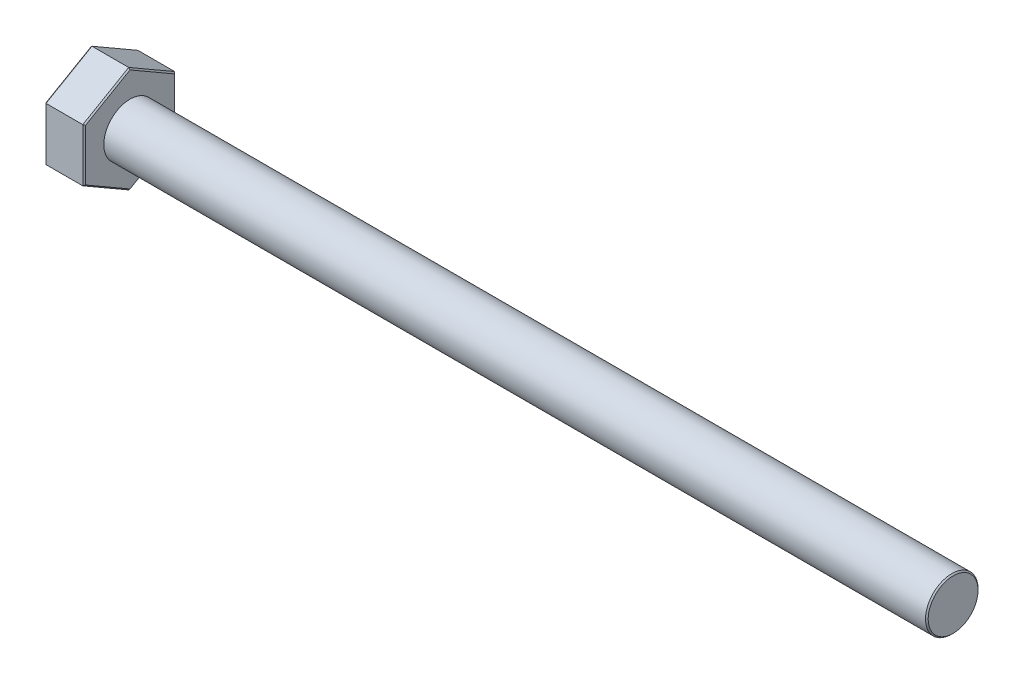
ISO-10303-21;
HEADER;
FILE_DESCRIPTION(('STEP AP214'),'2;1');
FILE_NAME('part.step','',(''),(''),'','','');
FILE_SCHEMA(('AUTOMOTIVE_DESIGN { 1 0 10303 214 1 1 1 1 }'));
ENDSEC;
DATA;
#1=APPLICATION_CONTEXT('core data for automotive mechanical design processes');
#2=APPLICATION_PROTOCOL_DEFINITION('international standard','automotive_design',2000,#1);
#3=PRODUCT_CONTEXT('',#1,'mechanical');
#4=PRODUCT('Part','Part','',(#3));
#5=PRODUCT_RELATED_PRODUCT_CATEGORY('part','',(#4));
#6=PRODUCT_DEFINITION_FORMATION('','',#4);
#7=PRODUCT_DEFINITION_CONTEXT('part definition',#1,'design');
#8=PRODUCT_DEFINITION('design','',#6,#7);
#9=PRODUCT_DEFINITION_SHAPE('','',#8);
#10=(LENGTH_UNIT() NAMED_UNIT(*) SI_UNIT(.MILLI.,.METRE.));
#11=(NAMED_UNIT(*) PLANE_ANGLE_UNIT() SI_UNIT($,.RADIAN.));
#12=(NAMED_UNIT(*) SI_UNIT($,.STERADIAN.) SOLID_ANGLE_UNIT());
#13=UNCERTAINTY_MEASURE_WITH_UNIT(LENGTH_MEASURE(1.E-05),#10,'distance_accuracy_value','');
#14=(GEOMETRIC_REPRESENTATION_CONTEXT(3) GLOBAL_UNCERTAINTY_ASSIGNED_CONTEXT((#13)) GLOBAL_UNIT_ASSIGNED_CONTEXT((#10,
#11,#12)) REPRESENTATION_CONTEXT('',''));
#15=CARTESIAN_POINT('',(0.,0.,0.));
#16=DIRECTION('',(0.,0.,1.));
#17=DIRECTION('',(1.,0.,0.));
#18=AXIS2_PLACEMENT_3D('',#15,#16,#17);
#19=CARTESIAN_POINT('',(-15.5546933939051,0.,0.));
#20=DIRECTION('',(-1.,0.,0.));
#21=DIRECTION('',(0.,0.,1.));
#22=AXIS2_PLACEMENT_3D('',#19,#20,#21);
#23=CYLINDRICAL_SURFACE('',#22,2.);
#24=CARTESIAN_POINT('',(62.6,0.,0.));
#25=DIRECTION('',(-1.,0.,0.));
#26=DIRECTION('',(0.,0.,1.));
#27=AXIS2_PLACEMENT_3D('',#24,#25,#26);
#28=CIRCLE('',#27,2.);
#29=CARTESIAN_POINT('',(62.6,0.,2.));
#30=VERTEX_POINT('',#29);
#31=EDGE_CURVE('E47',#30,#30,#28,.T.);
#32=ORIENTED_EDGE('',*,*,#31,.T.);
#33=EDGE_LOOP('',(#32));
#34=FACE_BOUND('',#33,.T.);
#35=CARTESIAN_POINT('',(0.,0.,0.));
#36=DIRECTION('',(-1.,0.,0.));
#37=DIRECTION('',(0.,0.,1.));
#38=AXIS2_PLACEMENT_3D('',#35,#36,#37);
#39=CIRCLE('',#38,2.);
#40=CARTESIAN_POINT('',(0.,0.,2.));
#41=VERTEX_POINT('',#40);
#42=EDGE_CURVE('E149',#41,#41,#39,.T.);
#43=ORIENTED_EDGE('',*,*,#42,.F.);
#44=EDGE_LOOP('',(#43));
#45=FACE_BOUND('',#44,.T.);
#46=ADVANCED_FACE('F39',(#34,#45),#23,.T.);
#47=CARTESIAN_POINT('',(62.7,2.,0.));
#48=DIRECTION('',(-1.,0.,0.));
#49=DIRECTION('',(0.,0.,1.));
#50=AXIS2_PLACEMENT_3D('',#47,#48,#49);
#51=PLANE('',#50);
#52=CARTESIAN_POINT('',(62.7,0.,0.));
#53=DIRECTION('',(-1.,0.,0.));
#54=DIRECTION('',(0.,0.,1.));
#55=AXIS2_PLACEMENT_3D('',#52,#53,#54);
#56=CIRCLE('',#55,1.89999999999999);
#57=CARTESIAN_POINT('',(62.7,0.,1.89999999999999));
#58=VERTEX_POINT('',#57);
#59=EDGE_CURVE('E11',#58,#58,#56,.F.);
#60=ORIENTED_EDGE('',*,*,#59,.T.);
#61=EDGE_LOOP('',(#60));
#62=FACE_BOUND('',#61,.T.);
#63=ADVANCED_FACE('F236',(#62),#51,.F.);
#64=CARTESIAN_POINT('',(0.,4.04145188432738,0.));
#65=DIRECTION('',(-1.,0.,0.));
#66=DIRECTION('',(0.,0.,1.));
#67=AXIS2_PLACEMENT_3D('',#64,#65,#66);
#68=PLANE('',#67);
#69=DIRECTION('',(0.,-0.5,-0.866025403784439));
#70=VECTOR('',#69,1.);
#71=CARTESIAN_POINT('',(0.,-1.93412340178524,3.45));
#72=LINE('',#71,#70);
#73=CARTESIAN_POINT('',(0.,-1.96299091524473,3.4));
#74=VERTEX_POINT('',#73);
#75=CARTESIAN_POINT('',(0.,-3.92598183048945,0.));
#76=VERTEX_POINT('',#75);
#77=EDGE_CURVE('E54',#74,#76,#72,.T.);
#78=ORIENTED_EDGE('',*,*,#77,.T.);
#79=DIRECTION('',(0.,0.5,-0.866025403784439));
#80=VECTOR('',#79,1.);
#81=CARTESIAN_POINT('',(0.,-1.93412340178524,-3.45));
#82=LINE('',#81,#80);
#83=CARTESIAN_POINT('',(0.,-1.96299091524472,-3.4));
#84=VERTEX_POINT('',#83);
#85=EDGE_CURVE('E192',#76,#84,#82,.T.);
#86=ORIENTED_EDGE('',*,*,#85,.T.);
#87=DIRECTION('',(0.,1.,0.));
#88=VECTOR('',#87,1.);
#89=CARTESIAN_POINT('',(0.,4.04145188432738,-3.4));
#90=LINE('',#89,#88);
#91=CARTESIAN_POINT('',(0.,1.96299091524473,-3.4));
#92=VERTEX_POINT('',#91);
#93=EDGE_CURVE('E184',#84,#92,#90,.T.);
#94=ORIENTED_EDGE('',*,*,#93,.T.);
#95=DIRECTION('',(0.,0.5,0.866025403784439));
#96=VECTOR('',#95,1.);
#97=CARTESIAN_POINT('',(0.,3.95484934394894,0.0500000000000027));
#98=LINE('',#97,#96);
#99=CARTESIAN_POINT('',(0.,3.92598183048945,0.));
#100=VERTEX_POINT('',#99);
#101=EDGE_CURVE('E186',#92,#100,#98,.T.);
#102=ORIENTED_EDGE('',*,*,#101,.T.);
#103=DIRECTION('',(0.,-0.5,0.866025403784439));
#104=VECTOR('',#103,1.);
#105=CARTESIAN_POINT('',(0.,3.95484934394894,-0.0500000000000007));
#106=LINE('',#105,#104);
#107=CARTESIAN_POINT('',(0.,1.96299091524473,3.4));
#108=VERTEX_POINT('',#107);
#109=EDGE_CURVE('E188',#100,#108,#106,.T.);
#110=ORIENTED_EDGE('',*,*,#109,.T.);
#111=DIRECTION('',(0.,-1.,0.));
#112=VECTOR('',#111,1.);
#113=CARTESIAN_POINT('',(0.,4.04145188432738,3.4));
#114=LINE('',#113,#112);
#115=EDGE_CURVE('E59',#108,#74,#114,.T.);
#116=ORIENTED_EDGE('',*,*,#115,.T.);
#117=EDGE_LOOP('',(#78,#86,#94,#102,#110,#116));
#118=FACE_BOUND('',#117,.T.);
#119=ORIENTED_EDGE('',*,*,#42,.T.);
#120=EDGE_LOOP('',(#119));
#121=FACE_BOUND('',#120,.T.);
#122=ADVANCED_FACE('F241',(#118,#121),#68,.F.);
#123=CARTESIAN_POINT('',(-3.,2.02072594216369,3.5));
#124=DIRECTION('',(0.,-0.866025403784439,-0.5));
#125=DIRECTION('',(0.,0.5,-0.866025403784439));
#126=AXIS2_PLACEMENT_3D('',#123,#124,#125);
#127=PLANE('',#126);
#128=DIRECTION('',(1.,0.,0.));
#129=VECTOR('',#128,1.);
#130=CARTESIAN_POINT('',(-3.,4.04145188432738,0.));
#131=LINE('',#130,#129);
#132=CARTESIAN_POINT('',(-2.9,4.04145188432738,0.));
#133=VERTEX_POINT('',#132);
#134=CARTESIAN_POINT('',(-0.0999999999999959,4.04145188432738,0.));
#135=VERTEX_POINT('',#134);
#136=EDGE_CURVE('E316',#133,#135,#131,.T.);
#137=ORIENTED_EDGE('',*,*,#136,.F.);
#138=DIRECTION('',(0.,-0.5,0.866025403784439));
#139=VECTOR('',#138,1.);
#140=CARTESIAN_POINT('',(-2.9,2.02072594216369,3.5));
#141=LINE('',#140,#139);
#142=CARTESIAN_POINT('',(-2.9,2.02072594216369,3.5));
#143=VERTEX_POINT('',#142);
#144=EDGE_CURVE('E182',#133,#143,#141,.T.);
#145=ORIENTED_EDGE('',*,*,#144,.T.);
#146=DIRECTION('',(1.,0.,0.));
#147=VECTOR('',#146,1.);
#148=CARTESIAN_POINT('',(-3.,2.02072594216369,3.5));
#149=LINE('',#148,#147);
#150=CARTESIAN_POINT('',(-0.0999999999999959,2.02072594216369,3.5));
#151=VERTEX_POINT('',#150);
#152=EDGE_CURVE('E205',#143,#151,#149,.T.);
#153=ORIENTED_EDGE('',*,*,#152,.T.);
#154=DIRECTION('',(0.,0.5,-0.866025403784439));
#155=VECTOR('',#154,1.);
#156=CARTESIAN_POINT('',(-0.0999999999999959,2.02072594216369,3.5));
#157=LINE('',#156,#155);
#158=EDGE_CURVE('E180',#151,#135,#157,.T.);
#159=ORIENTED_EDGE('',*,*,#158,.T.);
#160=EDGE_LOOP('',(#137,#145,#153,#159));
#161=FACE_BOUND('',#160,.T.);
#162=ADVANCED_FACE('F344',(#161),#127,.F.);
#163=CARTESIAN_POINT('',(-3.,4.04145188432738,0.));
#164=DIRECTION('',(0.,-0.866025403784439,0.5));
#165=DIRECTION('',(0.,-0.5,-0.866025403784439));
#166=AXIS2_PLACEMENT_3D('',#163,#164,#165);
#167=PLANE('',#166);
#168=DIRECTION('',(1.,0.,0.));
#169=VECTOR('',#168,1.);
#170=CARTESIAN_POINT('',(-3.,2.02072594216369,-3.5));
#171=LINE('',#170,#169);
#172=CARTESIAN_POINT('',(-2.9,2.02072594216369,-3.5));
#173=VERTEX_POINT('',#172);
#174=CARTESIAN_POINT('',(-0.0999999999999959,2.02072594216369,-3.5));
#175=VERTEX_POINT('',#174);
#176=EDGE_CURVE('E308',#173,#175,#171,.T.);
#177=ORIENTED_EDGE('',*,*,#176,.F.);
#178=DIRECTION('',(0.,0.5,0.866025403784439));
#179=VECTOR('',#178,1.);
#180=CARTESIAN_POINT('',(-2.9,4.04145188432738,0.));
#181=LINE('',#180,#179);
#182=EDGE_CURVE('E178',#173,#133,#181,.T.);
#183=ORIENTED_EDGE('',*,*,#182,.T.);
#184=ORIENTED_EDGE('',*,*,#136,.T.);
#185=DIRECTION('',(0.,-0.5,-0.866025403784439));
#186=VECTOR('',#185,1.);
#187=CARTESIAN_POINT('',(-0.0999999999999959,4.04145188432738,0.));
#188=LINE('',#187,#186);
#189=EDGE_CURVE('E176',#135,#175,#188,.T.);
#190=ORIENTED_EDGE('',*,*,#189,.T.);
#191=EDGE_LOOP('',(#177,#183,#184,#190));
#192=FACE_BOUND('',#191,.T.);
#193=ADVANCED_FACE('F348',(#192),#167,.F.);
#194=CARTESIAN_POINT('',(-3.,2.02072594216369,-3.5));
#195=DIRECTION('',(0.,0.,1.));
#196=DIRECTION('',(1.,0.,0.));
#197=AXIS2_PLACEMENT_3D('',#194,#195,#196);
#198=PLANE('',#197);
#199=DIRECTION('',(1.,0.,0.));
#200=VECTOR('',#199,1.);
#201=CARTESIAN_POINT('',(-3.,-2.02072594216369,-3.5));
#202=LINE('',#201,#200);
#203=CARTESIAN_POINT('',(-2.9,-2.02072594216369,-3.5));
#204=VERTEX_POINT('',#203);
#205=CARTESIAN_POINT('',(-0.0999999999999959,-2.02072594216369,-3.5));
#206=VERTEX_POINT('',#205);
#207=EDGE_CURVE('E305',#204,#206,#202,.T.);
#208=ORIENTED_EDGE('',*,*,#207,.F.);
#209=DIRECTION('',(0.,1.,0.));
#210=VECTOR('',#209,1.);
#211=CARTESIAN_POINT('',(-2.9,2.02072594216369,-3.5));
#212=LINE('',#211,#210);
#213=EDGE_CURVE('E174',#204,#173,#212,.T.);
#214=ORIENTED_EDGE('',*,*,#213,.T.);
#215=ORIENTED_EDGE('',*,*,#176,.T.);
#216=DIRECTION('',(0.,-1.,0.));
#217=VECTOR('',#216,1.);
#218=CARTESIAN_POINT('',(-0.0999999999999959,2.02072594216369,-3.5));
#219=LINE('',#218,#217);
#220=EDGE_CURVE('E172',#175,#206,#219,.T.);
#221=ORIENTED_EDGE('',*,*,#220,.T.);
#222=EDGE_LOOP('',(#208,#214,#215,#221));
#223=FACE_BOUND('',#222,.T.);
#224=ADVANCED_FACE('F304',(#223),#198,.F.);
#225=CARTESIAN_POINT('',(-3.,-2.02072594216369,-3.5));
#226=DIRECTION('',(0.,0.866025403784439,0.5));
#227=DIRECTION('',(0.,-0.5,0.866025403784439));
#228=AXIS2_PLACEMENT_3D('',#225,#226,#227);
#229=PLANE('',#228);
#230=DIRECTION('',(1.,0.,0.));
#231=VECTOR('',#230,1.);
#232=CARTESIAN_POINT('',(-3.,-4.04145188432738,0.));
#233=LINE('',#232,#231);
#234=CARTESIAN_POINT('',(-2.9,-4.04145188432738,0.));
#235=VERTEX_POINT('',#234);
#236=CARTESIAN_POINT('',(-0.0999999999999959,-4.04145188432738,0.));
#237=VERTEX_POINT('',#236);
#238=EDGE_CURVE('E314',#235,#237,#233,.T.);
#239=ORIENTED_EDGE('',*,*,#238,.F.);
#240=DIRECTION('',(0.,0.5,-0.866025403784439));
#241=VECTOR('',#240,1.);
#242=CARTESIAN_POINT('',(-2.9,-2.02072594216369,-3.5));
#243=LINE('',#242,#241);
#244=EDGE_CURVE('E170',#235,#204,#243,.T.);
#245=ORIENTED_EDGE('',*,*,#244,.T.);
#246=ORIENTED_EDGE('',*,*,#207,.T.);
#247=DIRECTION('',(0.,-0.5,0.866025403784439));
#248=VECTOR('',#247,1.);
#249=CARTESIAN_POINT('',(-0.0999999999999959,-2.02072594216369,-3.5));
#250=LINE('',#249,#248);
#251=EDGE_CURVE('E167',#206,#237,#250,.T.);
#252=ORIENTED_EDGE('',*,*,#251,.T.);
#253=EDGE_LOOP('',(#239,#245,#246,#252));
#254=FACE_BOUND('',#253,.T.);
#255=ADVANCED_FACE('F311',(#254),#229,.F.);
#256=CARTESIAN_POINT('',(-3.,-4.04145188432738,0.));
#257=DIRECTION('',(0.,0.866025403784439,-0.5));
#258=DIRECTION('',(0.,0.5,0.866025403784439));
#259=AXIS2_PLACEMENT_3D('',#256,#257,#258);
#260=PLANE('',#259);
#261=DIRECTION('',(1.,0.,0.));
#262=VECTOR('',#261,1.);
#263=CARTESIAN_POINT('',(-3.,-2.02072594216369,3.5));
#264=LINE('',#263,#262);
#265=CARTESIAN_POINT('',(-2.9,-2.02072594216369,3.5));
#266=VERTEX_POINT('',#265);
#267=CARTESIAN_POINT('',(-0.0999999999999959,-2.02072594216369,3.5));
#268=VERTEX_POINT('',#267);
#269=EDGE_CURVE('E318',#266,#268,#264,.T.);
#270=ORIENTED_EDGE('',*,*,#269,.F.);
#271=DIRECTION('',(0.,-0.5,-0.866025403784439));
#272=VECTOR('',#271,1.);
#273=CARTESIAN_POINT('',(-2.9,-4.04145188432738,0.));
#274=LINE('',#273,#272);
#275=EDGE_CURVE('E165',#266,#235,#274,.T.);
#276=ORIENTED_EDGE('',*,*,#275,.T.);
#277=ORIENTED_EDGE('',*,*,#238,.T.);
#278=DIRECTION('',(0.,0.5,0.866025403784439));
#279=VECTOR('',#278,1.);
#280=CARTESIAN_POINT('',(-0.0999999999999959,-4.04145188432738,0.));
#281=LINE('',#280,#279);
#282=EDGE_CURVE('E163',#237,#268,#281,.T.);
#283=ORIENTED_EDGE('',*,*,#282,.T.);
#284=EDGE_LOOP('',(#270,#276,#277,#283));
#285=FACE_BOUND('',#284,.T.);
#286=ADVANCED_FACE('F340',(#285),#260,.F.);
#287=CARTESIAN_POINT('',(-3.,-2.02072594216369,3.5));
#288=DIRECTION('',(0.,0.,-1.));
#289=DIRECTION('',(0.,1.,0.));
#290=AXIS2_PLACEMENT_3D('',#287,#288,#289);
#291=PLANE('',#290);
#292=ORIENTED_EDGE('',*,*,#152,.F.);
#293=DIRECTION('',(0.,-1.,0.));
#294=VECTOR('',#293,1.);
#295=CARTESIAN_POINT('',(-2.9,-2.02072594216369,3.5));
#296=LINE('',#295,#294);
#297=EDGE_CURVE('E135',#143,#266,#296,.T.);
#298=ORIENTED_EDGE('',*,*,#297,.T.);
#299=ORIENTED_EDGE('',*,*,#269,.T.);
#300=DIRECTION('',(0.,1.,0.));
#301=VECTOR('',#300,1.);
#302=CARTESIAN_POINT('',(-0.0999999999999959,-2.02072594216369,3.5));
#303=LINE('',#302,#301);
#304=EDGE_CURVE('E155',#268,#151,#303,.T.);
#305=ORIENTED_EDGE('',*,*,#304,.T.);
#306=EDGE_LOOP('',(#292,#298,#299,#305));
#307=FACE_BOUND('',#306,.T.);
#308=ADVANCED_FACE('F338',(#307),#291,.F.);
#309=CARTESIAN_POINT('',(-3.,4.04145188432738,0.));
#310=DIRECTION('',(-1.,0.,0.));
#311=DIRECTION('',(0.,0.,1.));
#312=AXIS2_PLACEMENT_3D('',#309,#310,#311);
#313=PLANE('',#312);
#314=DIRECTION('',(0.,0.5,0.866025403784439));
#315=VECTOR('',#314,1.);
#316=CARTESIAN_POINT('',(-3.,-1.93412340178525,3.45));
#317=LINE('',#316,#315);
#318=CARTESIAN_POINT('',(-3.,-3.92598183048946,0.));
#319=VERTEX_POINT('',#318);
#320=CARTESIAN_POINT('',(-3.,-1.96299091524473,3.4));
#321=VERTEX_POINT('',#320);
#322=EDGE_CURVE('E153',#319,#321,#317,.T.);
#323=ORIENTED_EDGE('',*,*,#322,.T.);
#324=DIRECTION('',(0.,1.,0.));
#325=VECTOR('',#324,1.);
#326=CARTESIAN_POINT('',(-3.,2.02072594216369,3.4));
#327=LINE('',#326,#325);
#328=CARTESIAN_POINT('',(-3.,1.96299091524473,3.4));
#329=VERTEX_POINT('',#328);
#330=EDGE_CURVE('E133',#321,#329,#327,.T.);
#331=ORIENTED_EDGE('',*,*,#330,.T.);
#332=DIRECTION('',(0.,0.5,-0.866025403784439));
#333=VECTOR('',#332,1.);
#334=CARTESIAN_POINT('',(-3.,3.95484934394894,-0.0499999999999981));
#335=LINE('',#334,#333);
#336=CARTESIAN_POINT('',(-3.,3.92598183048946,0.));
#337=VERTEX_POINT('',#336);
#338=EDGE_CURVE('E142',#329,#337,#335,.T.);
#339=ORIENTED_EDGE('',*,*,#338,.T.);
#340=DIRECTION('',(0.,-0.5,-0.866025403784439));
#341=VECTOR('',#340,1.);
#342=CARTESIAN_POINT('',(-3.,1.93412340178525,-3.45));
#343=LINE('',#342,#341);
#344=CARTESIAN_POINT('',(-3.,1.96299091524473,-3.4));
#345=VERTEX_POINT('',#344);
#346=EDGE_CURVE('E148',#337,#345,#343,.T.);
#347=ORIENTED_EDGE('',*,*,#346,.T.);
#348=DIRECTION('',(0.,-1.,0.));
#349=VECTOR('',#348,1.);
#350=CARTESIAN_POINT('',(-3.,-2.02072594216369,-3.4));
#351=LINE('',#350,#349);
#352=CARTESIAN_POINT('',(-3.,-1.96299091524473,-3.4));
#353=VERTEX_POINT('',#352);
#354=EDGE_CURVE('E327',#345,#353,#351,.T.);
#355=ORIENTED_EDGE('',*,*,#354,.T.);
#356=DIRECTION('',(0.,-0.5,0.866025403784439));
#357=VECTOR('',#356,1.);
#358=CARTESIAN_POINT('',(-3.,-3.95484934394894,0.0499999999999982));
#359=LINE('',#358,#357);
#360=EDGE_CURVE('E158',#353,#319,#359,.T.);
#361=ORIENTED_EDGE('',*,*,#360,.T.);
#362=EDGE_LOOP('',(#323,#331,#339,#347,#355,#361));
#363=FACE_BOUND('',#362,.T.);
#364=ADVANCED_FACE('F151',(#363),#313,.T.);
#365=CARTESIAN_POINT('',(-3.,4.04145188432738,-3.4));
#366=DIRECTION('',(-0.707106781186552,0.,-0.707106781186543));
#367=DIRECTION('',(-0.707106781186543,0.,0.707106781186552));
#368=AXIS2_PLACEMENT_3D('',#365,#366,#367);
#369=PLANE('',#368);
#370=DIRECTION('',(-0.654653670707973,-0.377964473009228,0.654653670707981));
#371=VECTOR('',#370,1.);
#372=CARTESIAN_POINT('',(-3.98571428571429,1.39388850704352,-2.4142857142857));
#373=LINE('',#372,#371);
#374=EDGE_CURVE('E199',#173,#345,#373,.T.);
#375=ORIENTED_EDGE('',*,*,#374,.F.);
#376=ORIENTED_EDGE('',*,*,#213,.F.);
#377=DIRECTION('',(-0.654653670707971,0.377964473009234,0.654653670707979));
#378=VECTOR('',#377,1.);
#379=CARTESIAN_POINT('',(-4.4857142857143,-1.10521337244868,-1.91428571428569));
#380=LINE('',#379,#378);
#381=EDGE_CURVE('E202',#353,#204,#380,.F.);
#382=ORIENTED_EDGE('',*,*,#381,.F.);
#383=ORIENTED_EDGE('',*,*,#354,.F.);
#384=EDGE_LOOP('',(#375,#376,#382,#383));
#385=FACE_BOUND('',#384,.T.);
#386=ADVANCED_FACE('F262',(#385),#369,.T.);
#387=CARTESIAN_POINT('',(-3.,-1.93412340178525,-3.45));
#388=DIRECTION('',(-0.707106781186555,-0.612372435695788,-0.35355339059327));
#389=DIRECTION('',(0.65465367070797,-0.755928946018461,0.));
#390=AXIS2_PLACEMENT_3D('',#387,#388,#389);
#391=PLANE('',#390);
#392=ORIENTED_EDGE('',*,*,#381,.T.);
#393=ORIENTED_EDGE('',*,*,#244,.F.);
#394=DIRECTION('',(-0.654653670707972,0.755928946018459,0.));
#395=VECTOR('',#394,1.);
#396=CARTESIAN_POINT('',(-3.98571428571427,-2.78777701408706,0.));
#397=LINE('',#396,#395);
#398=EDGE_CURVE('E196',#319,#235,#397,.F.);
#399=ORIENTED_EDGE('',*,*,#398,.F.);
#400=ORIENTED_EDGE('',*,*,#360,.F.);
#401=EDGE_LOOP('',(#392,#393,#399,#400));
#402=FACE_BOUND('',#401,.T.);
#403=ADVANCED_FACE('F258',(#402),#391,.T.);
#404=CARTESIAN_POINT('',(-3.,3.95484934394894,0.0499999999999998));
#405=DIRECTION('',(-0.707106781186551,0.612372435695791,-0.353553390593272));
#406=DIRECTION('',(-0.654653670707973,-0.755928946018458,0.));
#407=AXIS2_PLACEMENT_3D('',#404,#405,#406);
#408=PLANE('',#407);
#409=ORIENTED_EDGE('',*,*,#374,.T.);
#410=ORIENTED_EDGE('',*,*,#346,.F.);
#411=DIRECTION('',(-0.654653670707974,-0.755928946018457,0.));
#412=VECTOR('',#411,1.);
#413=CARTESIAN_POINT('',(-2.98571428571429,3.94247755246631,0.));
#414=LINE('',#413,#412);
#415=EDGE_CURVE('E145',#133,#337,#414,.T.);
#416=ORIENTED_EDGE('',*,*,#415,.F.);
#417=ORIENTED_EDGE('',*,*,#182,.F.);
#418=EDGE_LOOP('',(#409,#410,#416,#417));
#419=FACE_BOUND('',#418,.T.);
#420=ADVANCED_FACE('F254',(#419),#408,.T.);
#421=CARTESIAN_POINT('',(-3.,-1.93412340178525,3.45));
#422=DIRECTION('',(-0.707106781186551,-0.612372435695792,0.353553390593272));
#423=DIRECTION('',(0.654653670707974,-0.755928946018457,0.));
#424=AXIS2_PLACEMENT_3D('',#421,#422,#423);
#425=PLANE('',#424);
#426=ORIENTED_EDGE('',*,*,#398,.T.);
#427=ORIENTED_EDGE('',*,*,#275,.F.);
#428=DIRECTION('',(-0.654653670707973,0.377964473009227,-0.654653670707982));
#429=VECTOR('',#428,1.);
#430=CARTESIAN_POINT('',(-2.98571428571429,-1.97123877623315,3.41428571428572));
#431=LINE('',#430,#429);
#432=EDGE_CURVE('E138',#321,#266,#431,.F.);
#433=ORIENTED_EDGE('',*,*,#432,.F.);
#434=ORIENTED_EDGE('',*,*,#322,.F.);
#435=EDGE_LOOP('',(#426,#427,#433,#434));
#436=FACE_BOUND('',#435,.T.);
#437=ADVANCED_FACE('F251',(#436),#425,.T.);
#438=CARTESIAN_POINT('',(-3.,3.95484934394894,-0.0499999999999978));
#439=DIRECTION('',(-0.70710678118655,0.612372435695792,0.353553390593273));
#440=DIRECTION('',(-0.654653670707975,-0.755928946018457,0.));
#441=AXIS2_PLACEMENT_3D('',#438,#439,#440);
#442=PLANE('',#441);
#443=ORIENTED_EDGE('',*,*,#415,.T.);
#444=ORIENTED_EDGE('',*,*,#338,.F.);
#445=DIRECTION('',(0.654653670707974,0.377964473009225,0.654653670707982));
#446=VECTOR('',#445,1.);
#447=CARTESIAN_POINT('',(-3.98571428571429,1.39388850704353,2.4142857142857));
#448=LINE('',#447,#446);
#449=EDGE_CURVE('E129',#143,#329,#448,.F.);
#450=ORIENTED_EDGE('',*,*,#449,.F.);
#451=ORIENTED_EDGE('',*,*,#144,.F.);
#452=EDGE_LOOP('',(#443,#444,#450,#451));
#453=FACE_BOUND('',#452,.T.);
#454=ADVANCED_FACE('F143',(#453),#442,.T.);
#455=CARTESIAN_POINT('',(-3.,4.04145188432738,3.4));
#456=DIRECTION('',(-0.707106781186552,0.,0.707106781186543));
#457=DIRECTION('',(0.707106781186543,0.,0.707106781186552));
#458=AXIS2_PLACEMENT_3D('',#455,#456,#457);
#459=PLANE('',#458);
#460=ORIENTED_EDGE('',*,*,#432,.T.);
#461=ORIENTED_EDGE('',*,*,#297,.F.);
#462=ORIENTED_EDGE('',*,*,#449,.T.);
#463=ORIENTED_EDGE('',*,*,#330,.F.);
#464=EDGE_LOOP('',(#460,#461,#462,#463));
#465=FACE_BOUND('',#464,.T.);
#466=ADVANCED_FACE('F131',(#465),#459,.T.);
#467=CARTESIAN_POINT('',(-0.0999999999999959,2.02072594216369,3.5));
#468=DIRECTION('',(-0.707106781186571,-0.612372435695774,-0.353553390593262));
#469=DIRECTION('',(0.654653670707952,-0.755928946018476,0.));
#470=AXIS2_PLACEMENT_3D('',#467,#468,#469);
#471=PLANE('',#470);
#472=DIRECTION('',(0.654653670707952,-0.377964473009237,-0.654653670707997));
#473=VECTOR('',#472,1.);
#474=CARTESIAN_POINT('',(-0.0999999999999959,2.02072594216369,3.5));
#475=LINE('',#474,#473);
#476=EDGE_CURVE('E216',#108,#151,#475,.F.);
#477=ORIENTED_EDGE('',*,*,#476,.F.);
#478=ORIENTED_EDGE('',*,*,#109,.F.);
#479=DIRECTION('',(0.654653670707951,-0.755928946018477,0.));
#480=VECTOR('',#479,1.);
#481=CARTESIAN_POINT('',(-0.0999999999999957,4.04145188432738,0.));
#482=LINE('',#481,#480);
#483=EDGE_CURVE('E139',#135,#100,#482,.T.);
#484=ORIENTED_EDGE('',*,*,#483,.F.);
#485=ORIENTED_EDGE('',*,*,#158,.F.);
#486=EDGE_LOOP('',(#477,#478,#484,#485));
#487=FACE_BOUND('',#486,.T.);
#488=ADVANCED_FACE('F248',(#487),#471,.F.);
#489=CARTESIAN_POINT('',(-0.0999999999999959,4.04145188432738,0.));
#490=DIRECTION('',(-0.707106781186573,-0.612372435695773,0.353553390593261));
#491=DIRECTION('',(0.654653670707951,-0.755928946018477,0.));
#492=AXIS2_PLACEMENT_3D('',#489,#490,#491);
#493=PLANE('',#492);
#494=ORIENTED_EDGE('',*,*,#483,.T.);
#495=ORIENTED_EDGE('',*,*,#101,.F.);
#496=DIRECTION('',(0.654653670707951,-0.37796447300924,0.654653670707996));
#497=VECTOR('',#496,1.);
#498=CARTESIAN_POINT('',(-0.0999999999999959,2.02072594216369,-3.5));
#499=LINE('',#498,#497);
#500=EDGE_CURVE('E213',#175,#92,#499,.T.);
#501=ORIENTED_EDGE('',*,*,#500,.F.);
#502=ORIENTED_EDGE('',*,*,#189,.F.);
#503=EDGE_LOOP('',(#494,#495,#501,#502));
#504=FACE_BOUND('',#503,.T.);
#505=ADVANCED_FACE('F277',(#504),#493,.F.);
#506=CARTESIAN_POINT('',(-0.0999999999999959,-2.02072594216369,3.5));
#507=DIRECTION('',(-0.707106781186572,0.,-0.707106781186523));
#508=DIRECTION('',(-0.707106781186523,0.,0.707106781186572));
#509=AXIS2_PLACEMENT_3D('',#506,#507,#508);
#510=PLANE('',#509);
#511=ORIENTED_EDGE('',*,*,#476,.T.);
#512=ORIENTED_EDGE('',*,*,#304,.F.);
#513=DIRECTION('',(0.654653670707951,0.377964473009239,-0.654653670707997));
#514=VECTOR('',#513,1.);
#515=CARTESIAN_POINT('',(-0.0999999999999961,-2.02072594216369,3.5));
#516=LINE('',#515,#514);
#517=EDGE_CURVE('E210',#74,#268,#516,.F.);
#518=ORIENTED_EDGE('',*,*,#517,.F.);
#519=ORIENTED_EDGE('',*,*,#115,.F.);
#520=EDGE_LOOP('',(#511,#512,#518,#519));
#521=FACE_BOUND('',#520,.T.);
#522=ADVANCED_FACE('F273',(#521),#510,.F.);
#523=CARTESIAN_POINT('',(-0.0999999999999959,2.02072594216369,-3.5));
#524=DIRECTION('',(-0.707106781186572,0.,0.707106781186523));
#525=DIRECTION('',(0.707106781186523,0.,0.707106781186572));
#526=AXIS2_PLACEMENT_3D('',#523,#524,#525);
#527=PLANE('',#526);
#528=ORIENTED_EDGE('',*,*,#500,.T.);
#529=ORIENTED_EDGE('',*,*,#93,.F.);
#530=DIRECTION('',(-0.654653670707949,-0.377964473009245,-0.654653670707995));
#531=VECTOR('',#530,1.);
#532=CARTESIAN_POINT('',(0.90000000000001,-1.44337567297401,-2.49999999999992));
#533=LINE('',#532,#531);
#534=EDGE_CURVE('E208',#206,#84,#533,.F.);
#535=ORIENTED_EDGE('',*,*,#534,.F.);
#536=ORIENTED_EDGE('',*,*,#220,.F.);
#537=EDGE_LOOP('',(#528,#529,#535,#536));
#538=FACE_BOUND('',#537,.T.);
#539=ADVANCED_FACE('F269',(#538),#527,.F.);
#540=CARTESIAN_POINT('',(-0.0999999999999959,-4.04145188432738,0.));
#541=DIRECTION('',(-0.707106781186572,0.612372435695773,-0.353553390593261));
#542=DIRECTION('',(-0.654653670707951,-0.755928946018477,0.));
#543=AXIS2_PLACEMENT_3D('',#540,#541,#542);
#544=PLANE('',#543);
#545=ORIENTED_EDGE('',*,*,#517,.T.);
#546=ORIENTED_EDGE('',*,*,#282,.F.);
#547=DIRECTION('',(0.654653670707949,0.755928946018479,0.));
#548=VECTOR('',#547,1.);
#549=CARTESIAN_POINT('',(-0.0999999999999959,-4.04145188432738,0.));
#550=LINE('',#549,#548);
#551=EDGE_CURVE('E206',#76,#237,#550,.F.);
#552=ORIENTED_EDGE('',*,*,#551,.F.);
#553=ORIENTED_EDGE('',*,*,#77,.F.);
#554=EDGE_LOOP('',(#545,#546,#552,#553));
#555=FACE_BOUND('',#554,.T.);
#556=ADVANCED_FACE('F231',(#555),#544,.F.);
#557=CARTESIAN_POINT('',(-0.0999999999999959,-2.02072594216369,-3.5));
#558=DIRECTION('',(-0.707106781186576,0.61237243569577,0.35355339059326));
#559=DIRECTION('',(-0.654653670707947,-0.75592894601848,0.));
#560=AXIS2_PLACEMENT_3D('',#557,#558,#559);
#561=PLANE('',#560);
#562=ORIENTED_EDGE('',*,*,#534,.T.);
#563=ORIENTED_EDGE('',*,*,#85,.F.);
#564=ORIENTED_EDGE('',*,*,#551,.T.);
#565=ORIENTED_EDGE('',*,*,#251,.F.);
#566=EDGE_LOOP('',(#562,#563,#564,#565));
#567=FACE_BOUND('',#566,.T.);
#568=ADVANCED_FACE('F226',(#567),#561,.F.);
#569=CARTESIAN_POINT('',(62.6,0.,0.));
#570=DIRECTION('',(-1.,0.,0.));
#571=DIRECTION('',(0.,0.,1.));
#572=AXIS2_PLACEMENT_3D('',#569,#570,#571);
#573=CONICAL_SURFACE('',#572,2.,0.785398163397479);
#574=ORIENTED_EDGE('',*,*,#59,.F.);
#575=EDGE_LOOP('',(#574));
#576=FACE_BOUND('',#575,.T.);
#577=ORIENTED_EDGE('',*,*,#31,.F.);
#578=EDGE_LOOP('',(#577));
#579=FACE_BOUND('',#578,.T.);
#580=ADVANCED_FACE('F41',(#576,#579),#573,.T.);
#581=CLOSED_SHELL('',(#46,#63,#122,#162,#193,#224,#255,#286,#308,#364,#386,#403,#420,#437,#454,
#466,#488,#505,#522,#539,#556,#568,#580));
#582=MANIFOLD_SOLID_BREP('B2',#581);
#583=ADVANCED_BREP_SHAPE_REPRESENTATION('',(#18,#582),#14);
#584=SHAPE_DEFINITION_REPRESENTATION(#9,#583);
ENDSEC;
END-ISO-10303-21;
